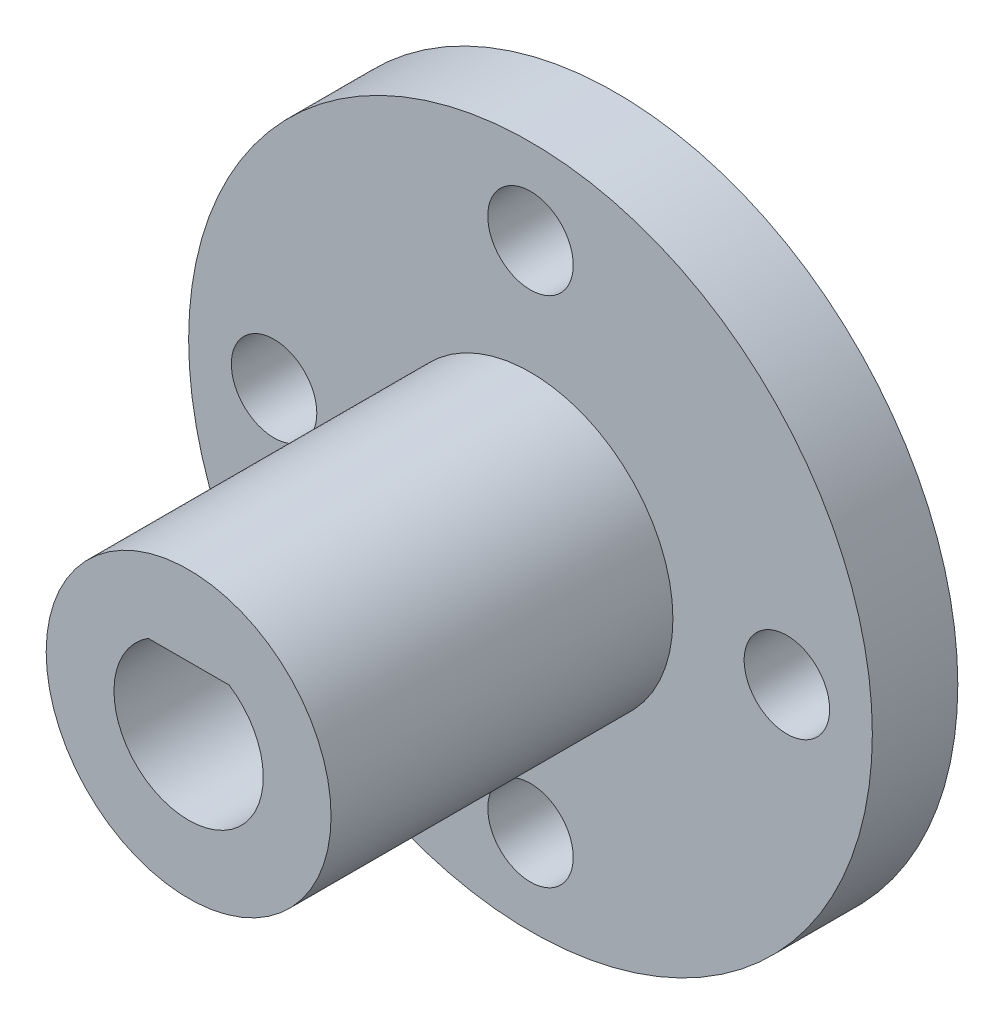
ISO-10303-21;
HEADER;
FILE_DESCRIPTION(('STEP AP214'),'2;1');
FILE_NAME('part.step','',(''),(''),'','','');
FILE_SCHEMA(('AUTOMOTIVE_DESIGN { 1 0 10303 214 1 1 1 1 }'));
ENDSEC;
DATA;
#1=APPLICATION_CONTEXT('core data for automotive mechanical design processes');
#2=APPLICATION_PROTOCOL_DEFINITION('international standard','automotive_design',2000,#1);
#3=PRODUCT_CONTEXT('',#1,'mechanical');
#4=PRODUCT('Part','Part','',(#3));
#5=PRODUCT_RELATED_PRODUCT_CATEGORY('part','',(#4));
#6=PRODUCT_DEFINITION_FORMATION('','',#4);
#7=PRODUCT_DEFINITION_CONTEXT('part definition',#1,'design');
#8=PRODUCT_DEFINITION('design','',#6,#7);
#9=PRODUCT_DEFINITION_SHAPE('','',#8);
#10=(LENGTH_UNIT() NAMED_UNIT(*) SI_UNIT(.MILLI.,.METRE.));
#11=(NAMED_UNIT(*) PLANE_ANGLE_UNIT() SI_UNIT($,.RADIAN.));
#12=(NAMED_UNIT(*) SI_UNIT($,.STERADIAN.) SOLID_ANGLE_UNIT());
#13=UNCERTAINTY_MEASURE_WITH_UNIT(LENGTH_MEASURE(1.E-05),#10,'distance_accuracy_value','');
#14=(GEOMETRIC_REPRESENTATION_CONTEXT(3) GLOBAL_UNCERTAINTY_ASSIGNED_CONTEXT((#13)) GLOBAL_UNIT_ASSIGNED_CONTEXT((#10,
#11,#12)) REPRESENTATION_CONTEXT('',''));
#15=CARTESIAN_POINT('',(0.,0.,0.));
#16=DIRECTION('',(0.,0.,1.));
#17=DIRECTION('',(1.,0.,0.));
#18=AXIS2_PLACEMENT_3D('',#15,#16,#17);
#19=CARTESIAN_POINT('',(0.,0.,0.));
#20=DIRECTION('',(0.,0.,1.));
#21=DIRECTION('',(1.,0.,0.));
#22=AXIS2_PLACEMENT_3D('',#19,#20,#21);
#23=PLANE('',#22);
#24=CARTESIAN_POINT('',(-9.,0.,0.));
#25=DIRECTION('',(0.,0.,1.));
#26=DIRECTION('',(1.,0.,0.));
#27=AXIS2_PLACEMENT_3D('',#24,#25,#26);
#28=CIRCLE('',#27,1.5);
#29=CARTESIAN_POINT('',(-7.5,0.,0.));
#30=VERTEX_POINT('',#29);
#31=EDGE_CURVE('E95',#30,#30,#28,.T.);
#32=ORIENTED_EDGE('',*,*,#31,.T.);
#33=EDGE_LOOP('',(#32));
#34=FACE_BOUND('',#33,.T.);
#35=CARTESIAN_POINT('',(0.,9.,0.));
#36=DIRECTION('',(0.,0.,1.));
#37=DIRECTION('',(1.,0.,0.));
#38=AXIS2_PLACEMENT_3D('',#35,#36,#37);
#39=CIRCLE('',#38,1.5);
#40=CARTESIAN_POINT('',(1.50000000000003,9.,0.));
#41=VERTEX_POINT('',#40);
#42=EDGE_CURVE('E111',#41,#41,#39,.T.);
#43=ORIENTED_EDGE('',*,*,#42,.T.);
#44=EDGE_LOOP('',(#43));
#45=FACE_BOUND('',#44,.T.);
#46=CARTESIAN_POINT('',(9.,0.,0.));
#47=DIRECTION('',(0.,0.,1.));
#48=DIRECTION('',(1.,0.,0.));
#49=AXIS2_PLACEMENT_3D('',#46,#47,#48);
#50=CIRCLE('',#49,1.5);
#51=CARTESIAN_POINT('',(10.5,0.,0.));
#52=VERTEX_POINT('',#51);
#53=EDGE_CURVE('E113',#52,#52,#50,.T.);
#54=ORIENTED_EDGE('',*,*,#53,.T.);
#55=EDGE_LOOP('',(#54));
#56=FACE_BOUND('',#55,.T.);
#57=CARTESIAN_POINT('',(0.,-9.,0.));
#58=DIRECTION('',(0.,0.,1.));
#59=DIRECTION('',(1.,0.,0.));
#60=AXIS2_PLACEMENT_3D('',#57,#58,#59);
#61=CIRCLE('',#60,1.5);
#62=CARTESIAN_POINT('',(1.4999999999999,-9.,0.));
#63=VERTEX_POINT('',#62);
#64=EDGE_CURVE('E118',#63,#63,#61,.T.);
#65=ORIENTED_EDGE('',*,*,#64,.T.);
#66=EDGE_LOOP('',(#65));
#67=FACE_BOUND('',#66,.T.);
#68=CARTESIAN_POINT('',(0.,0.,0.));
#69=DIRECTION('',(0.,0.,1.));
#70=DIRECTION('',(1.,0.,0.));
#71=AXIS2_PLACEMENT_3D('',#68,#69,#70);
#72=CIRCLE('',#71,12.);
#73=CARTESIAN_POINT('',(12.,0.,0.));
#74=VERTEX_POINT('',#73);
#75=EDGE_CURVE('E44',#74,#74,#72,.T.);
#76=ORIENTED_EDGE('',*,*,#75,.F.);
#77=EDGE_LOOP('',(#76));
#78=FACE_BOUND('',#77,.T.);
#79=CARTESIAN_POINT('',(0.,0.,0.));
#80=DIRECTION('',(0.,0.,1.));
#81=DIRECTION('',(1.,0.,0.));
#82=AXIS2_PLACEMENT_3D('',#79,#80,#81);
#83=CIRCLE('',#82,2.62);
#84=CARTESIAN_POINT('',(-1.42157636446306,2.2008,0.));
#85=VERTEX_POINT('',#84);
#86=CARTESIAN_POINT('',(1.42157636446306,2.2008,0.));
#87=VERTEX_POINT('',#86);
#88=EDGE_CURVE('E65',#85,#87,#83,.T.);
#89=ORIENTED_EDGE('',*,*,#88,.T.);
#90=DIRECTION('',(-1.,0.,0.));
#91=VECTOR('',#90,1.);
#92=CARTESIAN_POINT('',(-0.0651103678380024,2.2008,0.));
#93=LINE('',#92,#91);
#94=EDGE_CURVE('E71',#87,#85,#93,.T.);
#95=ORIENTED_EDGE('',*,*,#94,.T.);
#96=EDGE_LOOP('',(#89,#95));
#97=FACE_BOUND('',#96,.T.);
#98=ADVANCED_FACE('F35',(#34,#45,#56,#67,#78,#97),#23,.F.);
#99=CARTESIAN_POINT('',(0.,0.,15.));
#100=DIRECTION('',(0.,0.,1.));
#101=DIRECTION('',(1.,0.,0.));
#102=AXIS2_PLACEMENT_3D('',#99,#100,#101);
#103=PLANE('',#102);
#104=CARTESIAN_POINT('',(0.,0.,15.));
#105=DIRECTION('',(0.,0.,1.));
#106=DIRECTION('',(1.,0.,0.));
#107=AXIS2_PLACEMENT_3D('',#104,#105,#106);
#108=CIRCLE('',#107,5.);
#109=CARTESIAN_POINT('',(5.,0.,15.));
#110=VERTEX_POINT('',#109);
#111=EDGE_CURVE('E83',#110,#110,#108,.T.);
#112=ORIENTED_EDGE('',*,*,#111,.T.);
#113=EDGE_LOOP('',(#112));
#114=FACE_BOUND('',#113,.T.);
#115=DIRECTION('',(-1.,0.,0.));
#116=VECTOR('',#115,1.);
#117=CARTESIAN_POINT('',(-0.0651103678380024,2.2008,15.));
#118=LINE('',#117,#116);
#119=CARTESIAN_POINT('',(1.42157636446306,2.2008,15.));
#120=VERTEX_POINT('',#119);
#121=CARTESIAN_POINT('',(-1.42157636446306,2.2008,15.));
#122=VERTEX_POINT('',#121);
#123=EDGE_CURVE('E74',#120,#122,#118,.T.);
#124=ORIENTED_EDGE('',*,*,#123,.F.);
#125=CARTESIAN_POINT('',(0.,0.,15.));
#126=DIRECTION('',(0.,0.,1.));
#127=DIRECTION('',(1.,0.,0.));
#128=AXIS2_PLACEMENT_3D('',#125,#126,#127);
#129=CIRCLE('',#128,2.62);
#130=EDGE_CURVE('E68',#122,#120,#129,.T.);
#131=ORIENTED_EDGE('',*,*,#130,.F.);
#132=EDGE_LOOP('',(#124,#131));
#133=FACE_BOUND('',#132,.T.);
#134=ADVANCED_FACE('F123',(#114,#133),#103,.T.);
#135=CARTESIAN_POINT('',(0.,0.,3.));
#136=DIRECTION('',(0.,0.,-1.));
#137=DIRECTION('',(-1.,0.,0.));
#138=AXIS2_PLACEMENT_3D('',#135,#136,#137);
#139=CYLINDRICAL_SURFACE('',#138,12.);
#140=CARTESIAN_POINT('',(0.,0.,3.));
#141=DIRECTION('',(0.,0.,1.));
#142=DIRECTION('',(1.,0.,0.));
#143=AXIS2_PLACEMENT_3D('',#140,#141,#142);
#144=CIRCLE('',#143,12.);
#145=CARTESIAN_POINT('',(12.,0.,3.));
#146=VERTEX_POINT('',#145);
#147=EDGE_CURVE('E11',#146,#146,#144,.T.);
#148=ORIENTED_EDGE('',*,*,#147,.F.);
#149=EDGE_LOOP('',(#148));
#150=FACE_BOUND('',#149,.T.);
#151=ORIENTED_EDGE('',*,*,#75,.T.);
#152=EDGE_LOOP('',(#151));
#153=FACE_BOUND('',#152,.T.);
#154=ADVANCED_FACE('F37',(#150,#153),#139,.T.);
#155=CARTESIAN_POINT('',(0.,0.,3.));
#156=DIRECTION('',(0.,0.,1.));
#157=DIRECTION('',(1.,0.,0.));
#158=AXIS2_PLACEMENT_3D('',#155,#156,#157);
#159=PLANE('',#158);
#160=CARTESIAN_POINT('',(-9.,0.,3.));
#161=DIRECTION('',(0.,0.,1.));
#162=DIRECTION('',(1.,0.,0.));
#163=AXIS2_PLACEMENT_3D('',#160,#161,#162);
#164=CIRCLE('',#163,1.5);
#165=CARTESIAN_POINT('',(-7.5,0.,3.));
#166=VERTEX_POINT('',#165);
#167=EDGE_CURVE('E39',#166,#166,#164,.F.);
#168=ORIENTED_EDGE('',*,*,#167,.T.);
#169=EDGE_LOOP('',(#168));
#170=FACE_BOUND('',#169,.T.);
#171=CARTESIAN_POINT('',(0.,9.,3.));
#172=DIRECTION('',(0.,0.,1.));
#173=DIRECTION('',(1.,0.,0.));
#174=AXIS2_PLACEMENT_3D('',#171,#172,#173);
#175=CIRCLE('',#174,1.5);
#176=CARTESIAN_POINT('',(1.50000000000003,9.,3.));
#177=VERTEX_POINT('',#176);
#178=EDGE_CURVE('E78',#177,#177,#175,.F.);
#179=ORIENTED_EDGE('',*,*,#178,.T.);
#180=EDGE_LOOP('',(#179));
#181=FACE_BOUND('',#180,.T.);
#182=CARTESIAN_POINT('',(9.,0.,3.));
#183=DIRECTION('',(0.,0.,1.));
#184=DIRECTION('',(1.,0.,0.));
#185=AXIS2_PLACEMENT_3D('',#182,#183,#184);
#186=CIRCLE('',#185,1.5);
#187=CARTESIAN_POINT('',(10.5,0.,3.));
#188=VERTEX_POINT('',#187);
#189=EDGE_CURVE('E94',#188,#188,#186,.F.);
#190=ORIENTED_EDGE('',*,*,#189,.T.);
#191=EDGE_LOOP('',(#190));
#192=FACE_BOUND('',#191,.T.);
#193=CARTESIAN_POINT('',(0.,-9.,3.));
#194=DIRECTION('',(0.,0.,1.));
#195=DIRECTION('',(1.,0.,0.));
#196=AXIS2_PLACEMENT_3D('',#193,#194,#195);
#197=CIRCLE('',#196,1.5);
#198=CARTESIAN_POINT('',(1.4999999999999,-9.,3.));
#199=VERTEX_POINT('',#198);
#200=EDGE_CURVE('E91',#199,#199,#197,.F.);
#201=ORIENTED_EDGE('',*,*,#200,.T.);
#202=EDGE_LOOP('',(#201));
#203=FACE_BOUND('',#202,.T.);
#204=CARTESIAN_POINT('',(0.,0.,3.));
#205=DIRECTION('',(0.,0.,1.));
#206=DIRECTION('',(1.,0.,0.));
#207=AXIS2_PLACEMENT_3D('',#204,#205,#206);
#208=CIRCLE('',#207,5.);
#209=CARTESIAN_POINT('',(5.,0.,3.));
#210=VERTEX_POINT('',#209);
#211=EDGE_CURVE('E86',#210,#210,#208,.F.);
#212=ORIENTED_EDGE('',*,*,#211,.T.);
#213=EDGE_LOOP('',(#212));
#214=FACE_BOUND('',#213,.T.);
#215=ORIENTED_EDGE('',*,*,#147,.T.);
#216=EDGE_LOOP('',(#215));
#217=FACE_BOUND('',#216,.T.);
#218=ADVANCED_FACE('F100',(#170,#181,#192,#203,#214,#217),#159,.T.);
#219=CARTESIAN_POINT('',(0.,0.,15.));
#220=DIRECTION('',(0.,0.,-1.));
#221=DIRECTION('',(-1.,0.,0.));
#222=AXIS2_PLACEMENT_3D('',#219,#220,#221);
#223=CYLINDRICAL_SURFACE('',#222,5.);
#224=ORIENTED_EDGE('',*,*,#211,.F.);
#225=EDGE_LOOP('',(#224));
#226=FACE_BOUND('',#225,.T.);
#227=ORIENTED_EDGE('',*,*,#111,.F.);
#228=EDGE_LOOP('',(#227));
#229=FACE_BOUND('',#228,.T.);
#230=ADVANCED_FACE('F136',(#226,#229),#223,.T.);
#231=CARTESIAN_POINT('',(0.,0.,15.));
#232=DIRECTION('',(0.,0.,-1.));
#233=DIRECTION('',(-1.,0.,0.));
#234=AXIS2_PLACEMENT_3D('',#231,#232,#233);
#235=CYLINDRICAL_SURFACE('',#234,2.62);
#236=ORIENTED_EDGE('',*,*,#88,.F.);
#237=DIRECTION('',(0.,0.,-1.));
#238=VECTOR('',#237,1.);
#239=CARTESIAN_POINT('',(-1.42157636446306,2.2008,15.));
#240=LINE('',#239,#238);
#241=EDGE_CURVE('E52',#122,#85,#240,.T.);
#242=ORIENTED_EDGE('',*,*,#241,.F.);
#243=ORIENTED_EDGE('',*,*,#130,.T.);
#244=DIRECTION('',(0.,0.,-1.));
#245=VECTOR('',#244,1.);
#246=CARTESIAN_POINT('',(1.42157636446306,2.2008,15.));
#247=LINE('',#246,#245);
#248=EDGE_CURVE('E57',#120,#87,#247,.T.);
#249=ORIENTED_EDGE('',*,*,#248,.T.);
#250=EDGE_LOOP('',(#236,#242,#243,#249));
#251=FACE_BOUND('',#250,.T.);
#252=ADVANCED_FACE('F63',(#251),#235,.F.);
#253=CARTESIAN_POINT('',(-0.0651103678380024,2.2008,15.));
#254=DIRECTION('',(0.,-1.,0.));
#255=DIRECTION('',(0.,0.,-1.));
#256=AXIS2_PLACEMENT_3D('',#253,#254,#255);
#257=PLANE('',#256);
#258=ORIENTED_EDGE('',*,*,#94,.F.);
#259=ORIENTED_EDGE('',*,*,#248,.F.);
#260=ORIENTED_EDGE('',*,*,#123,.T.);
#261=ORIENTED_EDGE('',*,*,#241,.T.);
#262=EDGE_LOOP('',(#258,#259,#260,#261));
#263=FACE_BOUND('',#262,.T.);
#264=ADVANCED_FACE('F72',(#263),#257,.T.);
#265=CARTESIAN_POINT('',(0.,-9.,5.));
#266=DIRECTION('',(0.,0.,-1.));
#267=DIRECTION('',(-1.,0.,0.));
#268=AXIS2_PLACEMENT_3D('',#265,#266,#267);
#269=CYLINDRICAL_SURFACE('',#268,1.5);
#270=ORIENTED_EDGE('',*,*,#200,.F.);
#271=EDGE_LOOP('',(#270));
#272=FACE_BOUND('',#271,.T.);
#273=ORIENTED_EDGE('',*,*,#64,.F.);
#274=EDGE_LOOP('',(#273));
#275=FACE_BOUND('',#274,.T.);
#276=ADVANCED_FACE('F158',(#272,#275),#269,.F.);
#277=CARTESIAN_POINT('',(9.,0.,5.));
#278=DIRECTION('',(0.,0.,-1.));
#279=DIRECTION('',(-1.,0.,0.));
#280=AXIS2_PLACEMENT_3D('',#277,#278,#279);
#281=CYLINDRICAL_SURFACE('',#280,1.5);
#282=ORIENTED_EDGE('',*,*,#189,.F.);
#283=EDGE_LOOP('',(#282));
#284=FACE_BOUND('',#283,.T.);
#285=ORIENTED_EDGE('',*,*,#53,.F.);
#286=EDGE_LOOP('',(#285));
#287=FACE_BOUND('',#286,.T.);
#288=ADVANCED_FACE('F107',(#284,#287),#281,.F.);
#289=CARTESIAN_POINT('',(0.,9.,5.));
#290=DIRECTION('',(0.,0.,-1.));
#291=DIRECTION('',(-1.,0.,0.));
#292=AXIS2_PLACEMENT_3D('',#289,#290,#291);
#293=CYLINDRICAL_SURFACE('',#292,1.5);
#294=ORIENTED_EDGE('',*,*,#178,.F.);
#295=EDGE_LOOP('',(#294));
#296=FACE_BOUND('',#295,.T.);
#297=ORIENTED_EDGE('',*,*,#42,.F.);
#298=EDGE_LOOP('',(#297));
#299=FACE_BOUND('',#298,.T.);
#300=ADVANCED_FACE('F103',(#296,#299),#293,.F.);
#301=CARTESIAN_POINT('',(-9.,0.,5.));
#302=DIRECTION('',(0.,0.,-1.));
#303=DIRECTION('',(-1.,0.,0.));
#304=AXIS2_PLACEMENT_3D('',#301,#302,#303);
#305=CYLINDRICAL_SURFACE('',#304,1.5);
#306=ORIENTED_EDGE('',*,*,#167,.F.);
#307=EDGE_LOOP('',(#306));
#308=FACE_BOUND('',#307,.T.);
#309=ORIENTED_EDGE('',*,*,#31,.F.);
#310=EDGE_LOOP('',(#309));
#311=FACE_BOUND('',#310,.T.);
#312=ADVANCED_FACE('F106',(#308,#311),#305,.F.);
#313=CLOSED_SHELL('',(#98,#134,#154,#218,#230,#252,#264,#276,#288,#300,#312));
#314=MANIFOLD_SOLID_BREP('B2',#313);
#315=ADVANCED_BREP_SHAPE_REPRESENTATION('',(#18,#314),#14);
#316=SHAPE_DEFINITION_REPRESENTATION(#9,#315);
ENDSEC;
END-ISO-10303-21;
